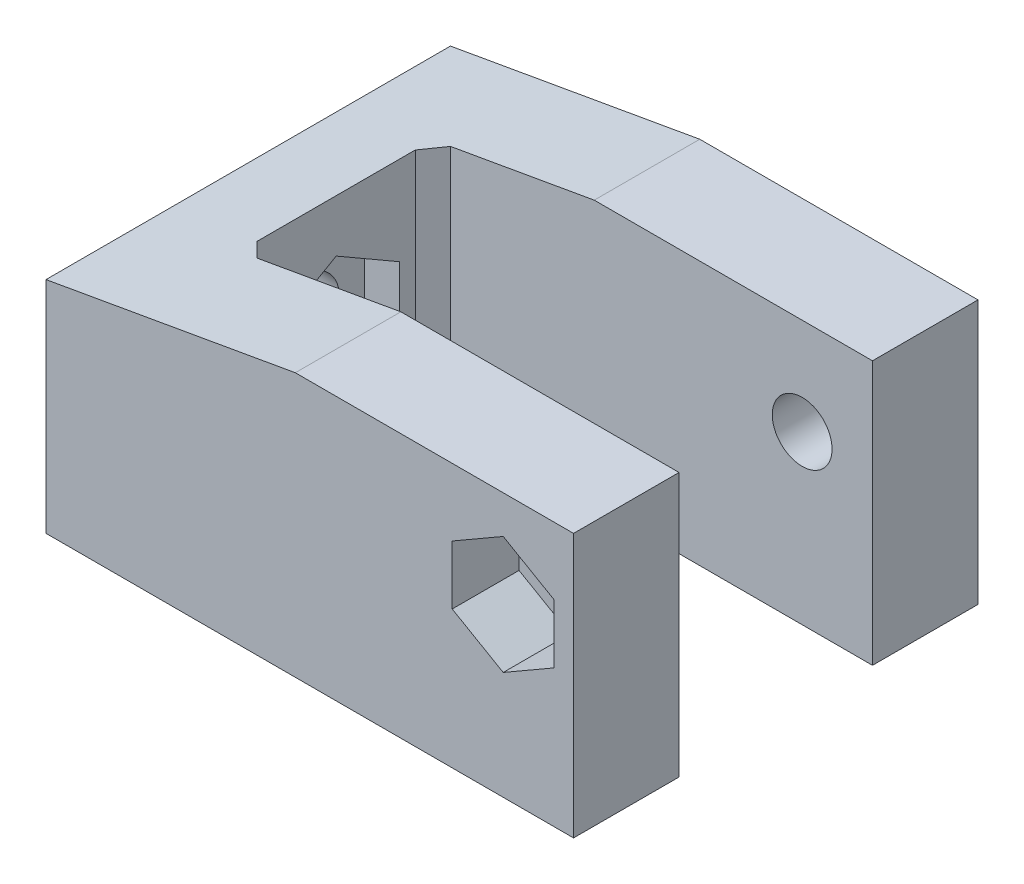
ISO-10303-21;
HEADER;
FILE_DESCRIPTION(('STEP AP214'),'2;1');
FILE_NAME('part.step','',(''),(''),'','','');
FILE_SCHEMA(('AUTOMOTIVE_DESIGN { 1 0 10303 214 1 1 1 1 }'));
ENDSEC;
DATA;
#1=APPLICATION_CONTEXT('core data for automotive mechanical design processes');
#2=APPLICATION_PROTOCOL_DEFINITION('international standard','automotive_design',2000,#1);
#3=PRODUCT_CONTEXT('',#1,'mechanical');
#4=PRODUCT('Part','Part','',(#3));
#5=PRODUCT_RELATED_PRODUCT_CATEGORY('part','',(#4));
#6=PRODUCT_DEFINITION_FORMATION('','',#4);
#7=PRODUCT_DEFINITION_CONTEXT('part definition',#1,'design');
#8=PRODUCT_DEFINITION('design','',#6,#7);
#9=PRODUCT_DEFINITION_SHAPE('','',#8);
#10=(LENGTH_UNIT() NAMED_UNIT(*) SI_UNIT(.MILLI.,.METRE.));
#11=(NAMED_UNIT(*) PLANE_ANGLE_UNIT() SI_UNIT($,.RADIAN.));
#12=(NAMED_UNIT(*) SI_UNIT($,.STERADIAN.) SOLID_ANGLE_UNIT());
#13=UNCERTAINTY_MEASURE_WITH_UNIT(LENGTH_MEASURE(1.E-05),#10,'distance_accuracy_value','');
#14=(GEOMETRIC_REPRESENTATION_CONTEXT(3) GLOBAL_UNCERTAINTY_ASSIGNED_CONTEXT((#13)) GLOBAL_UNIT_ASSIGNED_CONTEXT((#10,
#11,#12)) REPRESENTATION_CONTEXT('',''));
#15=CARTESIAN_POINT('',(0.,0.,0.));
#16=DIRECTION('',(0.,0.,1.));
#17=DIRECTION('',(1.,0.,0.));
#18=AXIS2_PLACEMENT_3D('',#15,#16,#17);
#19=CARTESIAN_POINT('',(26.,9.49999999999999,0.));
#20=DIRECTION('',(0.,0.,-1.));
#21=DIRECTION('',(0.,1.,0.));
#22=AXIS2_PLACEMENT_3D('',#19,#20,#21);
#23=CYLINDRICAL_SURFACE('',#22,1.7);
#24=CARTESIAN_POINT('',(26.,9.49999999999999,-6.));
#25=DIRECTION('',(0.,0.,1.));
#26=DIRECTION('',(0.,-1.,0.));
#27=AXIS2_PLACEMENT_3D('',#24,#25,#26);
#28=CIRCLE('',#27,1.7);
#29=CARTESIAN_POINT('',(26.,7.79999999999999,-6.));
#30=VERTEX_POINT('',#29);
#31=EDGE_CURVE('E359',#30,#30,#28,.T.);
#32=ORIENTED_EDGE('',*,*,#31,.F.);
#33=EDGE_LOOP('',(#32));
#34=FACE_BOUND('',#33,.T.);
#35=CARTESIAN_POINT('',(26.,9.49999999999999,-3.8));
#36=DIRECTION('',(0.,0.,1.));
#37=DIRECTION('',(1.,0.,0.));
#38=AXIS2_PLACEMENT_3D('',#35,#36,#37);
#39=CIRCLE('',#38,1.7);
#40=CARTESIAN_POINT('',(27.7,9.49999999999999,-3.8));
#41=VERTEX_POINT('',#40);
#42=EDGE_CURVE('E267',#41,#41,#39,.F.);
#43=ORIENTED_EDGE('',*,*,#42,.F.);
#44=EDGE_LOOP('',(#43));
#45=FACE_BOUND('',#44,.T.);
#46=ADVANCED_FACE('F41',(#34,#45),#23,.F.);
#47=CARTESIAN_POINT('',(26.,9.5,-17.));
#48=DIRECTION('',(0.,0.,-1.));
#49=DIRECTION('',(-1.,0.,0.));
#50=AXIS2_PLACEMENT_3D('',#47,#48,#49);
#51=CIRCLE('',#50,1.7);
#52=CARTESIAN_POINT('',(24.3,9.5,-17.));
#53=VERTEX_POINT('',#52);
#54=EDGE_CURVE('E360',#53,#53,#51,.T.);
#55=ORIENTED_EDGE('',*,*,#54,.F.);
#56=EDGE_LOOP('',(#55));
#57=FACE_BOUND('',#56,.T.);
#58=CARTESIAN_POINT('',(26.,9.5,-20.5));
#59=DIRECTION('',(0.,0.,-1.));
#60=DIRECTION('',(-1.,0.,0.));
#61=AXIS2_PLACEMENT_3D('',#58,#59,#60);
#62=CIRCLE('',#61,1.7);
#63=CARTESIAN_POINT('',(24.3,9.5,-20.5));
#64=VERTEX_POINT('',#63);
#65=EDGE_CURVE('E283',#64,#64,#62,.F.);
#66=ORIENTED_EDGE('',*,*,#65,.F.);
#67=EDGE_LOOP('',(#66));
#68=FACE_BOUND('',#67,.T.);
#69=ADVANCED_FACE('F557',(#57,#68),#23,.F.);
#70=CARTESIAN_POINT('',(10.,6.24999999999995,-11.5));
#71=DIRECTION('',(-1.,0.,0.));
#72=DIRECTION('',(0.,0.,1.));
#73=AXIS2_PLACEMENT_3D('',#70,#71,#72);
#74=CYLINDRICAL_SURFACE('',#73,2.2);
#75=CARTESIAN_POINT('',(0.,6.24999999999995,-11.5));
#76=DIRECTION('',(-1.,0.,0.));
#77=DIRECTION('',(0.,0.,1.));
#78=AXIS2_PLACEMENT_3D('',#75,#76,#77);
#79=CIRCLE('',#78,2.2);
#80=CARTESIAN_POINT('',(0.,6.24999999999995,-9.3));
#81=VERTEX_POINT('',#80);
#82=EDGE_CURVE('E355',#81,#81,#79,.T.);
#83=ORIENTED_EDGE('',*,*,#82,.T.);
#84=EDGE_LOOP('',(#83));
#85=FACE_BOUND('',#84,.T.);
#86=CARTESIAN_POINT('',(3.,6.24999999999995,-11.5));
#87=DIRECTION('',(1.,0.,0.));
#88=DIRECTION('',(0.,0.,-1.));
#89=AXIS2_PLACEMENT_3D('',#86,#87,#88);
#90=CIRCLE('',#89,2.2);
#91=CARTESIAN_POINT('',(3.,6.24999999999995,-13.7));
#92=VERTEX_POINT('',#91);
#93=EDGE_CURVE('E339',#92,#92,#90,.F.);
#94=ORIENTED_EDGE('',*,*,#93,.F.);
#95=EDGE_LOOP('',(#94));
#96=FACE_BOUND('',#95,.T.);
#97=ADVANCED_FACE('F555',(#85,#96),#74,.F.);
#98=CARTESIAN_POINT('',(30.,15.,0.));
#99=DIRECTION('',(0.,-1.,0.));
#100=DIRECTION('',(0.,0.,-1.));
#101=AXIS2_PLACEMENT_3D('',#98,#99,#100);
#102=PLANE('',#101);
#103=DIRECTION('',(-1.,0.,0.));
#104=VECTOR('',#103,1.);
#105=CARTESIAN_POINT('',(30.,15.,-23.));
#106=LINE('',#105,#104);
#107=CARTESIAN_POINT('',(30.,15.,-23.));
#108=VERTEX_POINT('',#107);
#109=CARTESIAN_POINT('',(14.1782045490451,15.,-23.));
#110=VERTEX_POINT('',#109);
#111=EDGE_CURVE('E419',#108,#110,#106,.T.);
#112=ORIENTED_EDGE('',*,*,#111,.T.);
#113=DIRECTION('',(0.,0.,1.));
#114=VECTOR('',#113,1.);
#115=CARTESIAN_POINT('',(14.1782045490451,15.,0.));
#116=LINE('',#115,#114);
#117=CARTESIAN_POINT('',(14.1782045490451,15.,-17.));
#118=VERTEX_POINT('',#117);
#119=EDGE_CURVE('E437',#110,#118,#116,.T.);
#120=ORIENTED_EDGE('',*,*,#119,.T.);
#121=DIRECTION('',(1.,0.,0.));
#122=VECTOR('',#121,1.);
#123=CARTESIAN_POINT('',(-18.6010752377383,15.,-17.));
#124=LINE('',#123,#122);
#125=CARTESIAN_POINT('',(30.,15.,-17.));
#126=VERTEX_POINT('',#125);
#127=EDGE_CURVE('E381',#118,#126,#124,.T.);
#128=ORIENTED_EDGE('',*,*,#127,.T.);
#129=DIRECTION('',(0.,0.,1.));
#130=VECTOR('',#129,1.);
#131=CARTESIAN_POINT('',(30.,15.,0.));
#132=LINE('',#131,#130);
#133=EDGE_CURVE('E403',#108,#126,#132,.T.);
#134=ORIENTED_EDGE('',*,*,#133,.F.);
#135=EDGE_LOOP('',(#112,#120,#128,#134));
#136=FACE_BOUND('',#135,.T.);
#137=ADVANCED_FACE('F507',(#136),#102,.F.);
#138=CARTESIAN_POINT('',(30.,0.,0.));
#139=DIRECTION('',(-1.,0.,0.));
#140=DIRECTION('',(0.,0.,1.));
#141=AXIS2_PLACEMENT_3D('',#138,#139,#140);
#142=PLANE('',#141);
#143=ORIENTED_EDGE('',*,*,#133,.T.);
#144=DIRECTION('',(0.,1.,0.));
#145=VECTOR('',#144,1.);
#146=CARTESIAN_POINT('',(30.,15.,-17.));
#147=LINE('',#146,#145);
#148=CARTESIAN_POINT('',(30.,0.,-17.));
#149=VERTEX_POINT('',#148);
#150=EDGE_CURVE('E365',#149,#126,#147,.T.);
#151=ORIENTED_EDGE('',*,*,#150,.F.);
#152=DIRECTION('',(0.,0.,-1.));
#153=VECTOR('',#152,1.);
#154=CARTESIAN_POINT('',(30.,0.,0.));
#155=LINE('',#154,#153);
#156=CARTESIAN_POINT('',(30.,0.,-23.));
#157=VERTEX_POINT('',#156);
#158=EDGE_CURVE('E393',#149,#157,#155,.T.);
#159=ORIENTED_EDGE('',*,*,#158,.T.);
#160=DIRECTION('',(0.,1.,0.));
#161=VECTOR('',#160,1.);
#162=CARTESIAN_POINT('',(30.,0.,-23.));
#163=LINE('',#162,#161);
#164=EDGE_CURVE('E399',#157,#108,#163,.T.);
#165=ORIENTED_EDGE('',*,*,#164,.T.);
#166=EDGE_LOOP('',(#143,#151,#159,#165));
#167=FACE_BOUND('',#166,.T.);
#168=ADVANCED_FACE('F494',(#167),#142,.F.);
#169=CARTESIAN_POINT('',(30.,0.,0.));
#170=DIRECTION('',(0.,0.,-1.));
#171=DIRECTION('',(0.,1.,0.));
#172=AXIS2_PLACEMENT_3D('',#169,#170,#171);
#173=PLANE('',#172);
#174=DIRECTION('',(0.,-1.,0.));
#175=VECTOR('',#174,1.);
#176=CARTESIAN_POINT('',(23.1,11.1743157806499,0.));
#177=LINE('',#176,#175);
#178=CARTESIAN_POINT('',(23.1,11.1743157806499,0.));
#179=VERTEX_POINT('',#178);
#180=CARTESIAN_POINT('',(23.1,7.82568421935007,0.));
#181=VERTEX_POINT('',#180);
#182=EDGE_CURVE('E250',#179,#181,#177,.T.);
#183=ORIENTED_EDGE('',*,*,#182,.F.);
#184=DIRECTION('',(-0.866025403784439,-0.5,0.));
#185=VECTOR('',#184,1.);
#186=CARTESIAN_POINT('',(26.,12.8486315612998,0.));
#187=LINE('',#186,#185);
#188=CARTESIAN_POINT('',(26.,12.8486315612998,0.));
#189=VERTEX_POINT('',#188);
#190=EDGE_CURVE('E208',#189,#179,#187,.T.);
#191=ORIENTED_EDGE('',*,*,#190,.F.);
#192=DIRECTION('',(-0.866025403784439,0.5,0.));
#193=VECTOR('',#192,1.);
#194=CARTESIAN_POINT('',(28.9,11.1743157806499,0.));
#195=LINE('',#194,#193);
#196=CARTESIAN_POINT('',(28.9,11.1743157806499,0.));
#197=VERTEX_POINT('',#196);
#198=EDGE_CURVE('E230',#197,#189,#195,.T.);
#199=ORIENTED_EDGE('',*,*,#198,.F.);
#200=DIRECTION('',(0.,1.,0.));
#201=VECTOR('',#200,1.);
#202=CARTESIAN_POINT('',(28.9,7.82568421935008,0.));
#203=LINE('',#202,#201);
#204=CARTESIAN_POINT('',(28.9,7.82568421935008,0.));
#205=VERTEX_POINT('',#204);
#206=EDGE_CURVE('E234',#205,#197,#203,.T.);
#207=ORIENTED_EDGE('',*,*,#206,.F.);
#208=DIRECTION('',(0.866025403784439,0.5,0.));
#209=VECTOR('',#208,1.);
#210=CARTESIAN_POINT('',(26.,6.15136843870016,0.));
#211=LINE('',#210,#209);
#212=CARTESIAN_POINT('',(26.,6.15136843870016,0.));
#213=VERTEX_POINT('',#212);
#214=EDGE_CURVE('E257',#213,#205,#211,.T.);
#215=ORIENTED_EDGE('',*,*,#214,.F.);
#216=DIRECTION('',(0.866025403784438,-0.5,0.));
#217=VECTOR('',#216,1.);
#218=CARTESIAN_POINT('',(23.1,7.82568421935007,0.));
#219=LINE('',#218,#217);
#220=EDGE_CURVE('E253',#181,#213,#219,.T.);
#221=ORIENTED_EDGE('',*,*,#220,.F.);
#222=EDGE_LOOP('',(#183,#191,#199,#207,#215,#221));
#223=FACE_BOUND('',#222,.T.);
#224=DIRECTION('',(-1.,0.,0.));
#225=VECTOR('',#224,1.);
#226=CARTESIAN_POINT('',(30.,15.,0.));
#227=LINE('',#226,#225);
#228=CARTESIAN_POINT('',(30.,15.,0.));
#229=VERTEX_POINT('',#228);
#230=CARTESIAN_POINT('',(14.1782045490451,15.,0.));
#231=VERTEX_POINT('',#230);
#232=EDGE_CURVE('E407',#229,#231,#227,.T.);
#233=ORIENTED_EDGE('',*,*,#232,.T.);
#234=DIRECTION('',(-0.984807753012209,-0.173648177666927,0.));
#235=VECTOR('',#234,1.);
#236=CARTESIAN_POINT('',(14.1782045490451,15.,0.));
#237=LINE('',#236,#235);
#238=CARTESIAN_POINT('',(0.,12.4999999999999,0.));
#239=VERTEX_POINT('',#238);
#240=EDGE_CURVE('E451',#231,#239,#237,.T.);
#241=ORIENTED_EDGE('',*,*,#240,.T.);
#242=DIRECTION('',(0.,-1.,0.));
#243=VECTOR('',#242,1.);
#244=CARTESIAN_POINT('',(0.,0.,0.));
#245=LINE('',#244,#243);
#246=CARTESIAN_POINT('',(0.,0.,0.));
#247=VERTEX_POINT('',#246);
#248=EDGE_CURVE('E388',#239,#247,#245,.T.);
#249=ORIENTED_EDGE('',*,*,#248,.T.);
#250=DIRECTION('',(-1.,0.,0.));
#251=VECTOR('',#250,1.);
#252=CARTESIAN_POINT('',(30.,0.,0.));
#253=LINE('',#252,#251);
#254=CARTESIAN_POINT('',(30.,0.,0.));
#255=VERTEX_POINT('',#254);
#256=EDGE_CURVE('E427',#255,#247,#253,.T.);
#257=ORIENTED_EDGE('',*,*,#256,.F.);
#258=DIRECTION('',(0.,-1.,0.));
#259=VECTOR('',#258,1.);
#260=CARTESIAN_POINT('',(30.,0.,0.));
#261=LINE('',#260,#259);
#262=EDGE_CURVE('E389',#229,#255,#261,.T.);
#263=ORIENTED_EDGE('',*,*,#262,.F.);
#264=EDGE_LOOP('',(#233,#241,#249,#257,#263));
#265=FACE_BOUND('',#264,.T.);
#266=ADVANCED_FACE('F535',(#223,#265),#173,.F.);
#267=CARTESIAN_POINT('',(30.,0.,0.));
#268=DIRECTION('',(0.,1.,0.));
#269=DIRECTION('',(0.,0.,1.));
#270=AXIS2_PLACEMENT_3D('',#267,#268,#269);
#271=PLANE('',#270);
#272=ORIENTED_EDGE('',*,*,#158,.F.);
#273=DIRECTION('',(1.,0.,0.));
#274=VECTOR('',#273,1.);
#275=CARTESIAN_POINT('',(-18.6010752377383,0.,-17.));
#276=LINE('',#275,#274);
#277=CARTESIAN_POINT('',(6.,0.,-17.));
#278=VERTEX_POINT('',#277);
#279=EDGE_CURVE('E376',#278,#149,#276,.T.);
#280=ORIENTED_EDGE('',*,*,#279,.F.);
#281=DIRECTION('',(0.707106781186544,0.,-0.707106781186551));
#282=VECTOR('',#281,1.);
#283=CARTESIAN_POINT('',(9.49999999999988,0.,-20.4999999999999));
#284=LINE('',#283,#282);
#285=CARTESIAN_POINT('',(5.,0.,-16.));
#286=VERTEX_POINT('',#285);
#287=EDGE_CURVE('E12',#278,#286,#284,.F.);
#288=ORIENTED_EDGE('',*,*,#287,.T.);
#289=DIRECTION('',(0.,0.,-1.));
#290=VECTOR('',#289,1.);
#291=CARTESIAN_POINT('',(5.,0.,-6.));
#292=LINE('',#291,#290);
#293=CARTESIAN_POINT('',(5.,0.,-7.00000000000001));
#294=VERTEX_POINT('',#293);
#295=EDGE_CURVE('E369',#294,#286,#292,.T.);
#296=ORIENTED_EDGE('',*,*,#295,.F.);
#297=DIRECTION('',(-0.707106781186544,0.,-0.707106781186551));
#298=VECTOR('',#297,1.);
#299=CARTESIAN_POINT('',(20.9999999999999,0.,9.00000000000003));
#300=LINE('',#299,#298);
#301=CARTESIAN_POINT('',(6.,0.,-6.));
#302=VERTEX_POINT('',#301);
#303=EDGE_CURVE('E482',#294,#302,#300,.F.);
#304=ORIENTED_EDGE('',*,*,#303,.T.);
#305=DIRECTION('',(1.,0.,0.));
#306=VECTOR('',#305,1.);
#307=CARTESIAN_POINT('',(-18.6010752377383,0.,-6.));
#308=LINE('',#307,#306);
#309=CARTESIAN_POINT('',(30.,0.,-6.));
#310=VERTEX_POINT('',#309);
#311=EDGE_CURVE('E380',#302,#310,#308,.T.);
#312=ORIENTED_EDGE('',*,*,#311,.T.);
#313=EDGE_CURVE('E395',#255,#310,#155,.T.);
#314=ORIENTED_EDGE('',*,*,#313,.F.);
#315=ORIENTED_EDGE('',*,*,#256,.T.);
#316=DIRECTION('',(0.,0.,-1.));
#317=VECTOR('',#316,1.);
#318=CARTESIAN_POINT('',(0.,0.,0.));
#319=LINE('',#318,#317);
#320=CARTESIAN_POINT('',(0.,0.,-23.));
#321=VERTEX_POINT('',#320);
#322=EDGE_CURVE('E410',#247,#321,#319,.T.);
#323=ORIENTED_EDGE('',*,*,#322,.T.);
#324=DIRECTION('',(-1.,0.,0.));
#325=VECTOR('',#324,1.);
#326=CARTESIAN_POINT('',(30.,0.,-23.));
#327=LINE('',#326,#325);
#328=EDGE_CURVE('E423',#157,#321,#327,.T.);
#329=ORIENTED_EDGE('',*,*,#328,.F.);
#330=EDGE_LOOP('',(#272,#280,#288,#296,#304,#312,#314,#315,#323,#329));
#331=FACE_BOUND('',#330,.T.);
#332=ADVANCED_FACE('F498',(#331),#271,.F.);
#333=CARTESIAN_POINT('',(30.,0.,-23.));
#334=DIRECTION('',(0.,0.,1.));
#335=DIRECTION('',(0.,-1.,0.));
#336=AXIS2_PLACEMENT_3D('',#333,#334,#335);
#337=PLANE('',#336);
#338=CARTESIAN_POINT('',(26.,9.5,-23.));
#339=DIRECTION('',(0.,0.,-1.));
#340=DIRECTION('',(-1.,0.,0.));
#341=AXIS2_PLACEMENT_3D('',#338,#339,#340);
#342=CIRCLE('',#341,3.25);
#343=CARTESIAN_POINT('',(22.75,9.5,-23.));
#344=VERTEX_POINT('',#343);
#345=EDGE_CURVE('E284',#344,#344,#342,.T.);
#346=ORIENTED_EDGE('',*,*,#345,.F.);
#347=EDGE_LOOP('',(#346));
#348=FACE_BOUND('',#347,.T.);
#349=DIRECTION('',(0.,1.,0.));
#350=VECTOR('',#349,1.);
#351=CARTESIAN_POINT('',(0.,0.,-23.));
#352=LINE('',#351,#350);
#353=CARTESIAN_POINT('',(0.,12.4999999999999,-23.));
#354=VERTEX_POINT('',#353);
#355=EDGE_CURVE('E394',#321,#354,#352,.T.);
#356=ORIENTED_EDGE('',*,*,#355,.T.);
#357=DIRECTION('',(0.984807753012209,0.173648177666927,0.));
#358=VECTOR('',#357,1.);
#359=CARTESIAN_POINT('',(14.1782045490451,15.,-23.));
#360=LINE('',#359,#358);
#361=EDGE_CURVE('E457',#354,#110,#360,.T.);
#362=ORIENTED_EDGE('',*,*,#361,.T.);
#363=ORIENTED_EDGE('',*,*,#111,.F.);
#364=ORIENTED_EDGE('',*,*,#164,.F.);
#365=ORIENTED_EDGE('',*,*,#328,.T.);
#366=EDGE_LOOP('',(#356,#362,#363,#364,#365));
#367=FACE_BOUND('',#366,.T.);
#368=ADVANCED_FACE('F502',(#348,#367),#337,.F.);
#369=DIRECTION('',(1.,0.,0.));
#370=VECTOR('',#369,1.);
#371=CARTESIAN_POINT('',(-18.6010752377383,15.,-6.));
#372=LINE('',#371,#370);
#373=CARTESIAN_POINT('',(14.1782045490451,15.,-6.));
#374=VERTEX_POINT('',#373);
#375=CARTESIAN_POINT('',(30.,15.,-6.));
#376=VERTEX_POINT('',#375);
#377=EDGE_CURVE('E377',#374,#376,#372,.T.);
#378=ORIENTED_EDGE('',*,*,#377,.F.);
#379=DIRECTION('',(0.,0.,1.));
#380=VECTOR('',#379,1.);
#381=CARTESIAN_POINT('',(14.1782045490451,15.,0.));
#382=LINE('',#381,#380);
#383=EDGE_CURVE('E431',#374,#231,#382,.T.);
#384=ORIENTED_EDGE('',*,*,#383,.T.);
#385=ORIENTED_EDGE('',*,*,#232,.F.);
#386=EDGE_CURVE('E402',#376,#229,#132,.T.);
#387=ORIENTED_EDGE('',*,*,#386,.F.);
#388=EDGE_LOOP('',(#378,#384,#385,#387));
#389=FACE_BOUND('',#388,.T.);
#390=ADVANCED_FACE('F543',(#389),#102,.F.);
#391=ORIENTED_EDGE('',*,*,#313,.T.);
#392=DIRECTION('',(0.,-1.,0.));
#393=VECTOR('',#392,1.);
#394=CARTESIAN_POINT('',(30.,15.,-6.));
#395=LINE('',#394,#393);
#396=EDGE_CURVE('E364',#376,#310,#395,.T.);
#397=ORIENTED_EDGE('',*,*,#396,.F.);
#398=ORIENTED_EDGE('',*,*,#386,.T.);
#399=ORIENTED_EDGE('',*,*,#262,.T.);
#400=EDGE_LOOP('',(#391,#397,#398,#399));
#401=FACE_BOUND('',#400,.T.);
#402=ADVANCED_FACE('F531',(#401),#142,.F.);
#403=CARTESIAN_POINT('',(0.,0.,0.));
#404=DIRECTION('',(-1.,0.,0.));
#405=DIRECTION('',(0.,0.,1.));
#406=AXIS2_PLACEMENT_3D('',#403,#404,#405);
#407=PLANE('',#406);
#408=ORIENTED_EDGE('',*,*,#82,.F.);
#409=EDGE_LOOP('',(#408));
#410=FACE_BOUND('',#409,.T.);
#411=ORIENTED_EDGE('',*,*,#248,.F.);
#412=DIRECTION('',(0.,0.,-1.));
#413=VECTOR('',#412,1.);
#414=CARTESIAN_POINT('',(0.,12.4999999999999,-23.));
#415=LINE('',#414,#413);
#416=EDGE_CURVE('E454',#239,#354,#415,.T.);
#417=ORIENTED_EDGE('',*,*,#416,.T.);
#418=ORIENTED_EDGE('',*,*,#355,.F.);
#419=ORIENTED_EDGE('',*,*,#322,.F.);
#420=EDGE_LOOP('',(#411,#417,#418,#419));
#421=FACE_BOUND('',#420,.T.);
#422=ADVANCED_FACE('F540',(#410,#421),#407,.T.);
#423=CARTESIAN_POINT('',(5.,0.,0.));
#424=DIRECTION('',(-1.,0.,0.));
#425=DIRECTION('',(0.,0.,1.));
#426=AXIS2_PLACEMENT_3D('',#423,#424,#425);
#427=PLANE('',#426);
#428=DIRECTION('',(0.,-1.,0.));
#429=VECTOR('',#428,1.);
#430=CARTESIAN_POINT('',(5.,8.3284609690826,-7.9));
#431=LINE('',#430,#429);
#432=CARTESIAN_POINT('',(5.,8.3284609690826,-7.9));
#433=VERTEX_POINT('',#432);
#434=CARTESIAN_POINT('',(5.,4.1715390309173,-7.9));
#435=VERTEX_POINT('',#434);
#436=EDGE_CURVE('E317',#433,#435,#431,.T.);
#437=ORIENTED_EDGE('',*,*,#436,.F.);
#438=DIRECTION('',(0.,-0.5,0.866025403784439));
#439=VECTOR('',#438,1.);
#440=CARTESIAN_POINT('',(5.,10.4069219381653,-11.5));
#441=LINE('',#440,#439);
#442=CARTESIAN_POINT('',(5.,10.4069219381653,-11.5));
#443=VERTEX_POINT('',#442);
#444=EDGE_CURVE('E314',#443,#433,#441,.T.);
#445=ORIENTED_EDGE('',*,*,#444,.F.);
#446=DIRECTION('',(0.,0.5,0.866025403784438));
#447=VECTOR('',#446,1.);
#448=CARTESIAN_POINT('',(5.,8.32846096908261,-15.1));
#449=LINE('',#448,#447);
#450=CARTESIAN_POINT('',(5.,8.32846096908261,-15.1));
#451=VERTEX_POINT('',#450);
#452=EDGE_CURVE('E293',#451,#443,#449,.T.);
#453=ORIENTED_EDGE('',*,*,#452,.F.);
#454=DIRECTION('',(0.,1.,0.));
#455=VECTOR('',#454,1.);
#456=CARTESIAN_POINT('',(5.,4.1715390309173,-15.1));
#457=LINE('',#456,#455);
#458=CARTESIAN_POINT('',(5.,4.1715390309173,-15.1));
#459=VERTEX_POINT('',#458);
#460=EDGE_CURVE('E329',#459,#451,#457,.T.);
#461=ORIENTED_EDGE('',*,*,#460,.F.);
#462=DIRECTION('',(0.,0.5,-0.866025403784438));
#463=VECTOR('',#462,1.);
#464=CARTESIAN_POINT('',(5.,2.09307806183464,-11.5));
#465=LINE('',#464,#463);
#466=CARTESIAN_POINT('',(5.,2.09307806183464,-11.5));
#467=VERTEX_POINT('',#466);
#468=EDGE_CURVE('E325',#467,#459,#465,.T.);
#469=ORIENTED_EDGE('',*,*,#468,.F.);
#470=DIRECTION('',(0.,-0.5,-0.866025403784438));
#471=VECTOR('',#470,1.);
#472=CARTESIAN_POINT('',(5.,4.1715390309173,-7.9));
#473=LINE('',#472,#471);
#474=EDGE_CURVE('E321',#435,#467,#473,.T.);
#475=ORIENTED_EDGE('',*,*,#474,.F.);
#476=EDGE_LOOP('',(#437,#445,#453,#461,#469,#475));
#477=FACE_BOUND('',#476,.T.);
#478=DIRECTION('',(0.,0.,1.));
#479=VECTOR('',#478,1.);
#480=CARTESIAN_POINT('',(5.,13.3816349035422,0.));
#481=LINE('',#480,#479);
#482=CARTESIAN_POINT('',(5.,13.3816349035422,-16.));
#483=VERTEX_POINT('',#482);
#484=CARTESIAN_POINT('',(5.,13.3816349035422,-7.00000000000001));
#485=VERTEX_POINT('',#484);
#486=EDGE_CURVE('E444',#483,#485,#481,.T.);
#487=ORIENTED_EDGE('',*,*,#486,.T.);
#488=DIRECTION('',(0.,-1.,0.));
#489=VECTOR('',#488,1.);
#490=CARTESIAN_POINT('',(5.,0.,-7.00000000000001));
#491=LINE('',#490,#489);
#492=EDGE_CURVE('E473',#485,#294,#491,.T.);
#493=ORIENTED_EDGE('',*,*,#492,.T.);
#494=ORIENTED_EDGE('',*,*,#295,.T.);
#495=DIRECTION('',(0.,1.,0.));
#496=VECTOR('',#495,1.);
#497=CARTESIAN_POINT('',(5.,13.3816349035422,-16.));
#498=LINE('',#497,#496);
#499=EDGE_CURVE('E460',#286,#483,#498,.T.);
#500=ORIENTED_EDGE('',*,*,#499,.T.);
#501=EDGE_LOOP('',(#487,#493,#494,#500));
#502=FACE_BOUND('',#501,.T.);
#503=ADVANCED_FACE('F515',(#477,#502),#427,.F.);
#504=CARTESIAN_POINT('',(-18.6010752377383,15.,-17.));
#505=DIRECTION('',(0.,0.,-1.));
#506=DIRECTION('',(-1.,0.,0.));
#507=AXIS2_PLACEMENT_3D('',#504,#505,#506);
#508=PLANE('',#507);
#509=ORIENTED_EDGE('',*,*,#54,.T.);
#510=EDGE_LOOP('',(#509));
#511=FACE_BOUND('',#510,.T.);
#512=DIRECTION('',(-0.984807753012209,-0.173648177666927,0.));
#513=VECTOR('',#512,1.);
#514=CARTESIAN_POINT('',(14.1782045490451,15.,-17.));
#515=LINE('',#514,#513);
#516=CARTESIAN_POINT('',(5.99999999999999,13.5579618842507,-17.));
#517=VERTEX_POINT('',#516);
#518=EDGE_CURVE('E441',#118,#517,#515,.T.);
#519=ORIENTED_EDGE('',*,*,#518,.T.);
#520=DIRECTION('',(0.,-1.,0.));
#521=VECTOR('',#520,1.);
#522=CARTESIAN_POINT('',(6.,0.,-17.));
#523=LINE('',#522,#521);
#524=EDGE_CURVE('E57',#517,#278,#523,.T.);
#525=ORIENTED_EDGE('',*,*,#524,.T.);
#526=ORIENTED_EDGE('',*,*,#279,.T.);
#527=ORIENTED_EDGE('',*,*,#150,.T.);
#528=ORIENTED_EDGE('',*,*,#127,.F.);
#529=EDGE_LOOP('',(#519,#525,#526,#527,#528));
#530=FACE_BOUND('',#529,.T.);
#531=ADVANCED_FACE('F509',(#511,#530),#508,.F.);
#532=CARTESIAN_POINT('',(-18.6010752377383,15.,-6.));
#533=DIRECTION('',(0.,0.,1.));
#534=DIRECTION('',(0.,-1.,0.));
#535=AXIS2_PLACEMENT_3D('',#532,#533,#534);
#536=PLANE('',#535);
#537=ORIENTED_EDGE('',*,*,#31,.T.);
#538=EDGE_LOOP('',(#537));
#539=FACE_BOUND('',#538,.T.);
#540=ORIENTED_EDGE('',*,*,#311,.F.);
#541=DIRECTION('',(0.,1.,0.));
#542=VECTOR('',#541,1.);
#543=CARTESIAN_POINT('',(6.,13.3816349035422,-6.));
#544=LINE('',#543,#542);
#545=CARTESIAN_POINT('',(5.99999999999999,13.5579618842507,-6.));
#546=VERTEX_POINT('',#545);
#547=EDGE_CURVE('E477',#302,#546,#544,.T.);
#548=ORIENTED_EDGE('',*,*,#547,.T.);
#549=DIRECTION('',(0.984807753012209,0.173648177666927,0.));
#550=VECTOR('',#549,1.);
#551=CARTESIAN_POINT('',(14.1782045490451,15.,-6.));
#552=LINE('',#551,#550);
#553=EDGE_CURVE('E448',#546,#374,#552,.T.);
#554=ORIENTED_EDGE('',*,*,#553,.T.);
#555=ORIENTED_EDGE('',*,*,#377,.T.);
#556=ORIENTED_EDGE('',*,*,#396,.T.);
#557=EDGE_LOOP('',(#540,#548,#554,#555,#556));
#558=FACE_BOUND('',#557,.T.);
#559=ADVANCED_FACE('F526',(#539,#558),#536,.F.);
#560=CARTESIAN_POINT('',(14.1782045490451,15.,0.));
#561=DIRECTION('',(-0.173648177666927,0.984807753012209,0.));
#562=DIRECTION('',(0.,0.,-1.));
#563=AXIS2_PLACEMENT_3D('',#560,#561,#562);
#564=PLANE('',#563);
#565=ORIENTED_EDGE('',*,*,#361,.F.);
#566=ORIENTED_EDGE('',*,*,#416,.F.);
#567=ORIENTED_EDGE('',*,*,#240,.F.);
#568=ORIENTED_EDGE('',*,*,#383,.F.);
#569=ORIENTED_EDGE('',*,*,#553,.F.);
#570=DIRECTION('',(0.70167384315986,0.123724030206481,0.701673843159867));
#571=VECTOR('',#570,1.);
#572=CARTESIAN_POINT('',(3.83828787466974,13.1767937120303,-8.16171212533028));
#573=LINE('',#572,#571);
#574=EDGE_CURVE('E485',#546,#485,#573,.F.);
#575=ORIENTED_EDGE('',*,*,#574,.T.);
#576=ORIENTED_EDGE('',*,*,#486,.F.);
#577=DIRECTION('',(-0.70167384315986,-0.123724030206481,0.701673843159867));
#578=VECTOR('',#577,1.);
#579=CARTESIAN_POINT('',(3.83828787466974,13.1767937120303,-14.8382878746697));
#580=LINE('',#579,#578);
#581=EDGE_CURVE('E50',#483,#517,#580,.F.);
#582=ORIENTED_EDGE('',*,*,#581,.T.);
#583=ORIENTED_EDGE('',*,*,#518,.F.);
#584=ORIENTED_EDGE('',*,*,#119,.F.);
#585=EDGE_LOOP('',(#565,#566,#567,#568,#569,#575,#576,#582,#583,#584));
#586=FACE_BOUND('',#585,.T.);
#587=ADVANCED_FACE('F517',(#586),#564,.T.);
#588=CARTESIAN_POINT('',(3.,0.,0.));
#589=DIRECTION('',(1.,0.,0.));
#590=DIRECTION('',(0.,0.,-1.));
#591=AXIS2_PLACEMENT_3D('',#588,#589,#590);
#592=PLANE('',#591);
#593=DIRECTION('',(0.,-0.5,0.866025403784439));
#594=VECTOR('',#593,1.);
#595=CARTESIAN_POINT('',(3.,10.4069219381653,-11.5));
#596=LINE('',#595,#594);
#597=CARTESIAN_POINT('',(3.,10.4069219381653,-11.5));
#598=VERTEX_POINT('',#597);
#599=CARTESIAN_POINT('',(3.,8.3284609690826,-7.9));
#600=VERTEX_POINT('',#599);
#601=EDGE_CURVE('E288',#598,#600,#596,.T.);
#602=ORIENTED_EDGE('',*,*,#601,.T.);
#603=DIRECTION('',(0.,-1.,0.));
#604=VECTOR('',#603,1.);
#605=CARTESIAN_POINT('',(3.,8.3284609690826,-7.9));
#606=LINE('',#605,#604);
#607=CARTESIAN_POINT('',(3.,4.1715390309173,-7.9));
#608=VERTEX_POINT('',#607);
#609=EDGE_CURVE('E292',#600,#608,#606,.T.);
#610=ORIENTED_EDGE('',*,*,#609,.T.);
#611=DIRECTION('',(0.,-0.5,-0.866025403784438));
#612=VECTOR('',#611,1.);
#613=CARTESIAN_POINT('',(3.,4.1715390309173,-7.9));
#614=LINE('',#613,#612);
#615=CARTESIAN_POINT('',(3.,2.09307806183464,-11.5));
#616=VERTEX_POINT('',#615);
#617=EDGE_CURVE('E297',#608,#616,#614,.T.);
#618=ORIENTED_EDGE('',*,*,#617,.T.);
#619=DIRECTION('',(0.,0.5,-0.866025403784438));
#620=VECTOR('',#619,1.);
#621=CARTESIAN_POINT('',(3.,2.09307806183464,-11.5));
#622=LINE('',#621,#620);
#623=CARTESIAN_POINT('',(3.,4.1715390309173,-15.1));
#624=VERTEX_POINT('',#623);
#625=EDGE_CURVE('E301',#616,#624,#622,.T.);
#626=ORIENTED_EDGE('',*,*,#625,.T.);
#627=DIRECTION('',(0.,1.,0.));
#628=VECTOR('',#627,1.);
#629=CARTESIAN_POINT('',(3.,4.1715390309173,-15.1));
#630=LINE('',#629,#628);
#631=CARTESIAN_POINT('',(3.,8.32846096908261,-15.1));
#632=VERTEX_POINT('',#631);
#633=EDGE_CURVE('E305',#624,#632,#630,.T.);
#634=ORIENTED_EDGE('',*,*,#633,.T.);
#635=DIRECTION('',(0.,0.5,0.866025403784438));
#636=VECTOR('',#635,1.);
#637=CARTESIAN_POINT('',(3.,8.32846096908261,-15.1));
#638=LINE('',#637,#636);
#639=EDGE_CURVE('E309',#632,#598,#638,.T.);
#640=ORIENTED_EDGE('',*,*,#639,.T.);
#641=EDGE_LOOP('',(#602,#610,#618,#626,#634,#640));
#642=FACE_BOUND('',#641,.T.);
#643=ORIENTED_EDGE('',*,*,#93,.T.);
#644=EDGE_LOOP('',(#643));
#645=FACE_BOUND('',#644,.T.);
#646=ADVANCED_FACE('F587',(#642,#645),#592,.T.);
#647=CARTESIAN_POINT('',(3.,10.4069219381653,-11.5));
#648=DIRECTION('',(0.,0.866025403784439,0.5));
#649=DIRECTION('',(0.,-0.5,0.866025403784439));
#650=AXIS2_PLACEMENT_3D('',#647,#648,#649);
#651=PLANE('',#650);
#652=ORIENTED_EDGE('',*,*,#444,.T.);
#653=DIRECTION('',(1.,0.,0.));
#654=VECTOR('',#653,1.);
#655=CARTESIAN_POINT('',(3.,8.3284609690826,-7.9));
#656=LINE('',#655,#654);
#657=EDGE_CURVE('E313',#600,#433,#656,.T.);
#658=ORIENTED_EDGE('',*,*,#657,.F.);
#659=ORIENTED_EDGE('',*,*,#601,.F.);
#660=DIRECTION('',(1.,0.,0.));
#661=VECTOR('',#660,1.);
#662=CARTESIAN_POINT('',(3.,10.4069219381653,-11.5));
#663=LINE('',#662,#661);
#664=EDGE_CURVE('E336',#598,#443,#663,.T.);
#665=ORIENTED_EDGE('',*,*,#664,.T.);
#666=EDGE_LOOP('',(#652,#658,#659,#665));
#667=FACE_BOUND('',#666,.T.);
#668=ADVANCED_FACE('F589',(#667),#651,.F.);
#669=CARTESIAN_POINT('',(3.,8.32846096908261,-15.1));
#670=DIRECTION('',(0.,0.866025403784439,-0.5));
#671=DIRECTION('',(0.,0.5,0.866025403784439));
#672=AXIS2_PLACEMENT_3D('',#669,#670,#671);
#673=PLANE('',#672);
#674=ORIENTED_EDGE('',*,*,#452,.T.);
#675=ORIENTED_EDGE('',*,*,#664,.F.);
#676=ORIENTED_EDGE('',*,*,#639,.F.);
#677=DIRECTION('',(1.,0.,0.));
#678=VECTOR('',#677,1.);
#679=CARTESIAN_POINT('',(3.,8.32846096908261,-15.1));
#680=LINE('',#679,#678);
#681=EDGE_CURVE('E340',#632,#451,#680,.T.);
#682=ORIENTED_EDGE('',*,*,#681,.T.);
#683=EDGE_LOOP('',(#674,#675,#676,#682));
#684=FACE_BOUND('',#683,.T.);
#685=ADVANCED_FACE('F596',(#684),#673,.F.);
#686=CARTESIAN_POINT('',(3.,4.1715390309173,-15.1));
#687=DIRECTION('',(0.,0.,-1.));
#688=DIRECTION('',(-1.,0.,0.));
#689=AXIS2_PLACEMENT_3D('',#686,#687,#688);
#690=PLANE('',#689);
#691=ORIENTED_EDGE('',*,*,#460,.T.);
#692=ORIENTED_EDGE('',*,*,#681,.F.);
#693=ORIENTED_EDGE('',*,*,#633,.F.);
#694=DIRECTION('',(1.,0.,0.));
#695=VECTOR('',#694,1.);
#696=CARTESIAN_POINT('',(3.,4.1715390309173,-15.1));
#697=LINE('',#696,#695);
#698=EDGE_CURVE('E343',#624,#459,#697,.T.);
#699=ORIENTED_EDGE('',*,*,#698,.T.);
#700=EDGE_LOOP('',(#691,#692,#693,#699));
#701=FACE_BOUND('',#700,.T.);
#702=ADVANCED_FACE('F605',(#701),#690,.F.);
#703=CARTESIAN_POINT('',(3.,2.09307806183464,-11.5));
#704=DIRECTION('',(0.,-0.866025403784439,-0.5));
#705=DIRECTION('',(0.,0.5,-0.866025403784439));
#706=AXIS2_PLACEMENT_3D('',#703,#704,#705);
#707=PLANE('',#706);
#708=ORIENTED_EDGE('',*,*,#468,.T.);
#709=ORIENTED_EDGE('',*,*,#698,.F.);
#710=ORIENTED_EDGE('',*,*,#625,.F.);
#711=DIRECTION('',(1.,0.,0.));
#712=VECTOR('',#711,1.);
#713=CARTESIAN_POINT('',(3.,2.09307806183464,-11.5));
#714=LINE('',#713,#712);
#715=EDGE_CURVE('E346',#616,#467,#714,.T.);
#716=ORIENTED_EDGE('',*,*,#715,.T.);
#717=EDGE_LOOP('',(#708,#709,#710,#716));
#718=FACE_BOUND('',#717,.T.);
#719=ADVANCED_FACE('F609',(#718),#707,.F.);
#720=CARTESIAN_POINT('',(3.,4.1715390309173,-7.9));
#721=DIRECTION('',(0.,-0.866025403784439,0.5));
#722=DIRECTION('',(0.,-0.5,-0.866025403784439));
#723=AXIS2_PLACEMENT_3D('',#720,#721,#722);
#724=PLANE('',#723);
#725=ORIENTED_EDGE('',*,*,#474,.T.);
#726=ORIENTED_EDGE('',*,*,#715,.F.);
#727=ORIENTED_EDGE('',*,*,#617,.F.);
#728=DIRECTION('',(1.,0.,0.));
#729=VECTOR('',#728,1.);
#730=CARTESIAN_POINT('',(3.,4.1715390309173,-7.9));
#731=LINE('',#730,#729);
#732=EDGE_CURVE('E349',#608,#435,#731,.T.);
#733=ORIENTED_EDGE('',*,*,#732,.T.);
#734=EDGE_LOOP('',(#725,#726,#727,#733));
#735=FACE_BOUND('',#734,.T.);
#736=ADVANCED_FACE('F613',(#735),#724,.F.);
#737=CARTESIAN_POINT('',(3.,8.3284609690826,-7.9));
#738=DIRECTION('',(0.,0.,1.));
#739=DIRECTION('',(0.,-1.,0.));
#740=AXIS2_PLACEMENT_3D('',#737,#738,#739);
#741=PLANE('',#740);
#742=ORIENTED_EDGE('',*,*,#436,.T.);
#743=ORIENTED_EDGE('',*,*,#732,.F.);
#744=ORIENTED_EDGE('',*,*,#609,.F.);
#745=ORIENTED_EDGE('',*,*,#657,.T.);
#746=EDGE_LOOP('',(#742,#743,#744,#745));
#747=FACE_BOUND('',#746,.T.);
#748=ADVANCED_FACE('F617',(#747),#741,.F.);
#749=CARTESIAN_POINT('',(26.,9.5,-20.5));
#750=DIRECTION('',(0.,0.,-1.));
#751=DIRECTION('',(-1.,0.,0.));
#752=AXIS2_PLACEMENT_3D('',#749,#750,#751);
#753=PLANE('',#752);
#754=CARTESIAN_POINT('',(26.,9.5,-20.5));
#755=DIRECTION('',(0.,0.,-1.));
#756=DIRECTION('',(-1.,0.,0.));
#757=AXIS2_PLACEMENT_3D('',#754,#755,#756);
#758=CIRCLE('',#757,3.25);
#759=CARTESIAN_POINT('',(22.75,9.5,-20.5));
#760=VERTEX_POINT('',#759);
#761=EDGE_CURVE('E279',#760,#760,#758,.T.);
#762=ORIENTED_EDGE('',*,*,#761,.T.);
#763=EDGE_LOOP('',(#762));
#764=FACE_BOUND('',#763,.T.);
#765=ORIENTED_EDGE('',*,*,#65,.T.);
#766=EDGE_LOOP('',(#765));
#767=FACE_BOUND('',#766,.T.);
#768=ADVANCED_FACE('F620',(#764,#767),#753,.T.);
#769=CARTESIAN_POINT('',(26.,9.5,-20.5));
#770=DIRECTION('',(0.,0.,-1.));
#771=DIRECTION('',(-1.,0.,0.));
#772=AXIS2_PLACEMENT_3D('',#769,#770,#771);
#773=CYLINDRICAL_SURFACE('',#772,3.25);
#774=ORIENTED_EDGE('',*,*,#761,.F.);
#775=EDGE_LOOP('',(#774));
#776=FACE_BOUND('',#775,.T.);
#777=ORIENTED_EDGE('',*,*,#345,.T.);
#778=EDGE_LOOP('',(#777));
#779=FACE_BOUND('',#778,.T.);
#780=ADVANCED_FACE('F601',(#776,#779),#773,.F.);
#781=CARTESIAN_POINT('',(0.,0.,-3.8));
#782=DIRECTION('',(0.,0.,1.));
#783=DIRECTION('',(1.,0.,0.));
#784=AXIS2_PLACEMENT_3D('',#781,#782,#783);
#785=PLANE('',#784);
#786=DIRECTION('',(-0.866025403784439,-0.5,0.));
#787=VECTOR('',#786,1.);
#788=CARTESIAN_POINT('',(26.,12.8486315612998,-3.8));
#789=LINE('',#788,#787);
#790=CARTESIAN_POINT('',(26.,12.8486315612998,-3.8));
#791=VERTEX_POINT('',#790);
#792=CARTESIAN_POINT('',(23.1,11.1743157806499,-3.8));
#793=VERTEX_POINT('',#792);
#794=EDGE_CURVE('E205',#791,#793,#789,.T.);
#795=ORIENTED_EDGE('',*,*,#794,.T.);
#796=DIRECTION('',(0.,-1.,0.));
#797=VECTOR('',#796,1.);
#798=CARTESIAN_POINT('',(23.1,11.1743157806499,-3.8));
#799=LINE('',#798,#797);
#800=CARTESIAN_POINT('',(23.1,7.82568421935007,-3.8));
#801=VERTEX_POINT('',#800);
#802=EDGE_CURVE('E217',#793,#801,#799,.T.);
#803=ORIENTED_EDGE('',*,*,#802,.T.);
#804=DIRECTION('',(0.866025403784438,-0.5,0.));
#805=VECTOR('',#804,1.);
#806=CARTESIAN_POINT('',(23.1,7.82568421935007,-3.8));
#807=LINE('',#806,#805);
#808=CARTESIAN_POINT('',(26.,6.15136843870016,-3.8));
#809=VERTEX_POINT('',#808);
#810=EDGE_CURVE('E223',#801,#809,#807,.T.);
#811=ORIENTED_EDGE('',*,*,#810,.T.);
#812=DIRECTION('',(0.866025403784439,0.5,0.));
#813=VECTOR('',#812,1.);
#814=CARTESIAN_POINT('',(26.,6.15136843870016,-3.8));
#815=LINE('',#814,#813);
#816=CARTESIAN_POINT('',(28.9,7.82568421935008,-3.8));
#817=VERTEX_POINT('',#816);
#818=EDGE_CURVE('E239',#809,#817,#815,.T.);
#819=ORIENTED_EDGE('',*,*,#818,.T.);
#820=DIRECTION('',(0.,1.,0.));
#821=VECTOR('',#820,1.);
#822=CARTESIAN_POINT('',(28.9,7.82568421935008,-3.8));
#823=LINE('',#822,#821);
#824=CARTESIAN_POINT('',(28.9,11.1743157806499,-3.8));
#825=VERTEX_POINT('',#824);
#826=EDGE_CURVE('E243',#817,#825,#823,.T.);
#827=ORIENTED_EDGE('',*,*,#826,.T.);
#828=DIRECTION('',(-0.866025403784439,0.5,0.));
#829=VECTOR('',#828,1.);
#830=CARTESIAN_POINT('',(28.9,11.1743157806499,-3.8));
#831=LINE('',#830,#829);
#832=EDGE_CURVE('E214',#825,#791,#831,.T.);
#833=ORIENTED_EDGE('',*,*,#832,.T.);
#834=EDGE_LOOP('',(#795,#803,#811,#819,#827,#833));
#835=FACE_BOUND('',#834,.T.);
#836=ORIENTED_EDGE('',*,*,#42,.T.);
#837=EDGE_LOOP('',(#836));
#838=FACE_BOUND('',#837,.T.);
#839=ADVANCED_FACE('F225',(#835,#838),#785,.T.);
#840=CARTESIAN_POINT('',(26.,12.8486315612998,-3.8));
#841=DIRECTION('',(-0.5,0.866025403784438,0.));
#842=DIRECTION('',(-0.866025403784439,-0.5,0.));
#843=AXIS2_PLACEMENT_3D('',#840,#841,#842);
#844=PLANE('',#843);
#845=ORIENTED_EDGE('',*,*,#190,.T.);
#846=DIRECTION('',(0.,0.,1.));
#847=VECTOR('',#846,1.);
#848=CARTESIAN_POINT('',(23.1,11.1743157806499,-3.8));
#849=LINE('',#848,#847);
#850=EDGE_CURVE('E201',#793,#179,#849,.T.);
#851=ORIENTED_EDGE('',*,*,#850,.F.);
#852=ORIENTED_EDGE('',*,*,#794,.F.);
#853=DIRECTION('',(0.,0.,1.));
#854=VECTOR('',#853,1.);
#855=CARTESIAN_POINT('',(26.,12.8486315612998,-3.8));
#856=LINE('',#855,#854);
#857=EDGE_CURVE('E264',#791,#189,#856,.T.);
#858=ORIENTED_EDGE('',*,*,#857,.T.);
#859=EDGE_LOOP('',(#845,#851,#852,#858));
#860=FACE_BOUND('',#859,.T.);
#861=ADVANCED_FACE('F203',(#860),#844,.F.);
#862=CARTESIAN_POINT('',(28.9,11.1743157806499,-3.8));
#863=DIRECTION('',(0.5,0.866025403784439,0.));
#864=DIRECTION('',(-0.866025403784439,0.5,0.));
#865=AXIS2_PLACEMENT_3D('',#862,#863,#864);
#866=PLANE('',#865);
#867=ORIENTED_EDGE('',*,*,#198,.T.);
#868=ORIENTED_EDGE('',*,*,#857,.F.);
#869=ORIENTED_EDGE('',*,*,#832,.F.);
#870=DIRECTION('',(0.,0.,1.));
#871=VECTOR('',#870,1.);
#872=CARTESIAN_POINT('',(28.9,11.1743157806499,-3.8));
#873=LINE('',#872,#871);
#874=EDGE_CURVE('E268',#825,#197,#873,.T.);
#875=ORIENTED_EDGE('',*,*,#874,.T.);
#876=EDGE_LOOP('',(#867,#868,#869,#875));
#877=FACE_BOUND('',#876,.T.);
#878=ADVANCED_FACE('F646',(#877),#866,.F.);
#879=CARTESIAN_POINT('',(28.9,7.82568421935008,-3.8));
#880=DIRECTION('',(1.,0.,0.));
#881=DIRECTION('',(0.,0.,-1.));
#882=AXIS2_PLACEMENT_3D('',#879,#880,#881);
#883=PLANE('',#882);
#884=ORIENTED_EDGE('',*,*,#206,.T.);
#885=ORIENTED_EDGE('',*,*,#874,.F.);
#886=ORIENTED_EDGE('',*,*,#826,.F.);
#887=DIRECTION('',(0.,0.,1.));
#888=VECTOR('',#887,1.);
#889=CARTESIAN_POINT('',(28.9,7.82568421935008,-3.8));
#890=LINE('',#889,#888);
#891=EDGE_CURVE('E271',#817,#205,#890,.T.);
#892=ORIENTED_EDGE('',*,*,#891,.T.);
#893=EDGE_LOOP('',(#884,#885,#886,#892));
#894=FACE_BOUND('',#893,.T.);
#895=ADVANCED_FACE('F656',(#894),#883,.F.);
#896=CARTESIAN_POINT('',(26.,6.15136843870016,-3.8));
#897=DIRECTION('',(0.5,-0.866025403784438,0.));
#898=DIRECTION('',(0.866025403784439,0.5,0.));
#899=AXIS2_PLACEMENT_3D('',#896,#897,#898);
#900=PLANE('',#899);
#901=ORIENTED_EDGE('',*,*,#214,.T.);
#902=ORIENTED_EDGE('',*,*,#891,.F.);
#903=ORIENTED_EDGE('',*,*,#818,.F.);
#904=DIRECTION('',(0.,0.,1.));
#905=VECTOR('',#904,1.);
#906=CARTESIAN_POINT('',(26.,6.15136843870016,-3.8));
#907=LINE('',#906,#905);
#908=EDGE_CURVE('E274',#809,#213,#907,.T.);
#909=ORIENTED_EDGE('',*,*,#908,.T.);
#910=EDGE_LOOP('',(#901,#902,#903,#909));
#911=FACE_BOUND('',#910,.T.);
#912=ADVANCED_FACE('F652',(#911),#900,.F.);
#913=CARTESIAN_POINT('',(23.1,7.82568421935007,-3.8));
#914=DIRECTION('',(-0.5,-0.866025403784438,0.));
#915=DIRECTION('',(0.866025403784439,-0.5,0.));
#916=AXIS2_PLACEMENT_3D('',#913,#914,#915);
#917=PLANE('',#916);
#918=ORIENTED_EDGE('',*,*,#220,.T.);
#919=ORIENTED_EDGE('',*,*,#908,.F.);
#920=ORIENTED_EDGE('',*,*,#810,.F.);
#921=DIRECTION('',(0.,0.,1.));
#922=VECTOR('',#921,1.);
#923=CARTESIAN_POINT('',(23.1,7.82568421935007,-3.8));
#924=LINE('',#923,#922);
#925=EDGE_CURVE('E213',#801,#181,#924,.T.);
#926=ORIENTED_EDGE('',*,*,#925,.T.);
#927=EDGE_LOOP('',(#918,#919,#920,#926));
#928=FACE_BOUND('',#927,.T.);
#929=ADVANCED_FACE('F649',(#928),#917,.F.);
#930=CARTESIAN_POINT('',(23.1,11.1743157806499,-3.8));
#931=DIRECTION('',(-1.,0.,0.));
#932=DIRECTION('',(0.,0.,1.));
#933=AXIS2_PLACEMENT_3D('',#930,#931,#932);
#934=PLANE('',#933);
#935=ORIENTED_EDGE('',*,*,#182,.T.);
#936=ORIENTED_EDGE('',*,*,#925,.F.);
#937=ORIENTED_EDGE('',*,*,#802,.F.);
#938=ORIENTED_EDGE('',*,*,#850,.T.);
#939=EDGE_LOOP('',(#935,#936,#937,#938));
#940=FACE_BOUND('',#939,.T.);
#941=ADVANCED_FACE('F218',(#940),#934,.F.);
#942=CARTESIAN_POINT('',(5.,0.,-7.00000000000001));
#943=DIRECTION('',(0.707106781186551,0.,-0.707106781186544));
#944=DIRECTION('',(0.,1.,0.));
#945=AXIS2_PLACEMENT_3D('',#942,#943,#944);
#946=PLANE('',#945);
#947=ORIENTED_EDGE('',*,*,#574,.F.);
#948=ORIENTED_EDGE('',*,*,#547,.F.);
#949=ORIENTED_EDGE('',*,*,#303,.F.);
#950=ORIENTED_EDGE('',*,*,#492,.F.);
#951=EDGE_LOOP('',(#947,#948,#949,#950));
#952=FACE_BOUND('',#951,.T.);
#953=ADVANCED_FACE('F523',(#952),#946,.T.);
#954=CARTESIAN_POINT('',(5.,0.,-16.));
#955=DIRECTION('',(0.707106781186551,0.,0.707106781186544));
#956=DIRECTION('',(0.,-1.,0.));
#957=AXIS2_PLACEMENT_3D('',#954,#955,#956);
#958=PLANE('',#957);
#959=ORIENTED_EDGE('',*,*,#287,.F.);
#960=ORIENTED_EDGE('',*,*,#524,.F.);
#961=ORIENTED_EDGE('',*,*,#581,.F.);
#962=ORIENTED_EDGE('',*,*,#499,.F.);
#963=EDGE_LOOP('',(#959,#960,#961,#962));
#964=FACE_BOUND('',#963,.T.);
#965=ADVANCED_FACE('F43',(#964),#958,.T.);
#966=CLOSED_SHELL('',(#46,#69,#97,#137,#168,#266,#332,#368,#390,#402,#422,#503,#531,#559,#587,
#646,#668,#685,#702,#719,#736,#748,#768,#780,#839,#861,#878,#895,#912,#929,#941,#953,#965));
#967=MANIFOLD_SOLID_BREP('B2',#966);
#968=ADVANCED_BREP_SHAPE_REPRESENTATION('',(#18,#967),#14);
#969=SHAPE_DEFINITION_REPRESENTATION(#9,#968);
ENDSEC;
END-ISO-10303-21;
